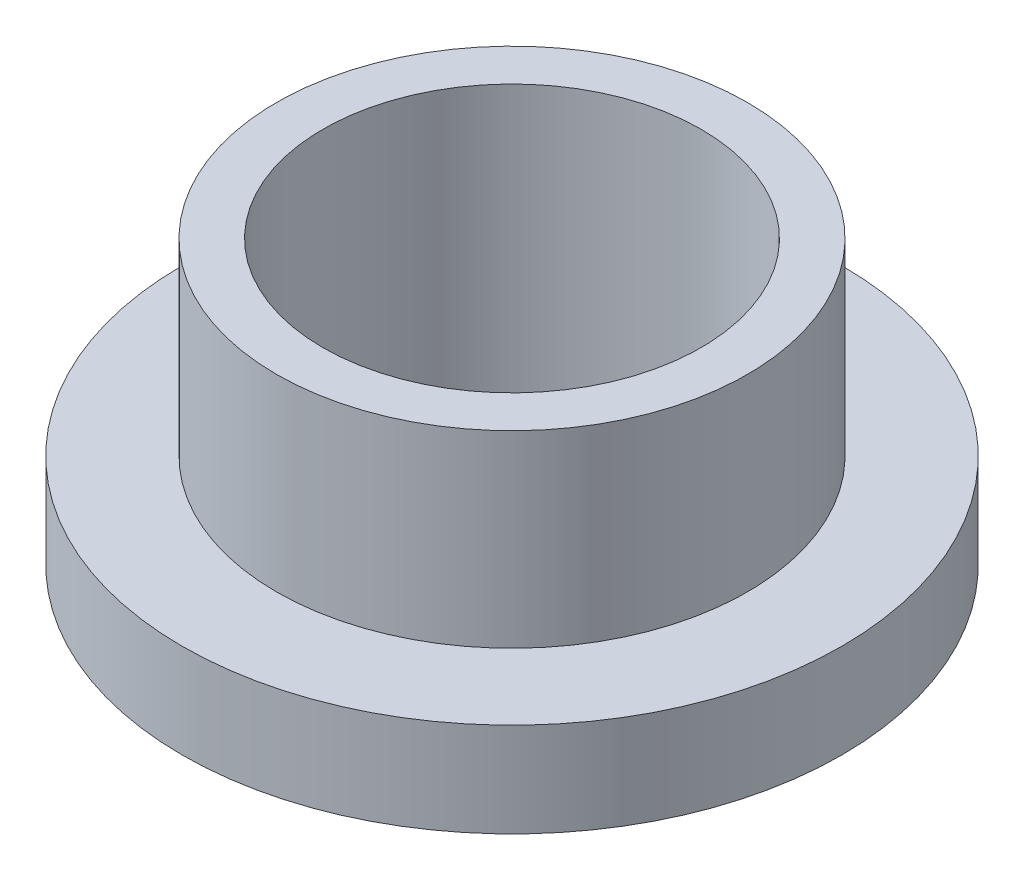
ISO-10303-21;
HEADER;
FILE_DESCRIPTION(('STEP AP214'),'2;1');
FILE_NAME('part.step','',(''),(''),'','','');
FILE_SCHEMA(('AUTOMOTIVE_DESIGN { 1 0 10303 214 1 1 1 1 }'));
ENDSEC;
DATA;
#1=APPLICATION_CONTEXT('core data for automotive mechanical design processes');
#2=APPLICATION_PROTOCOL_DEFINITION('international standard','automotive_design',2000,#1);
#3=PRODUCT_CONTEXT('',#1,'mechanical');
#4=PRODUCT('Part','Part','',(#3));
#5=PRODUCT_RELATED_PRODUCT_CATEGORY('part','',(#4));
#6=PRODUCT_DEFINITION_FORMATION('','',#4);
#7=PRODUCT_DEFINITION_CONTEXT('part definition',#1,'design');
#8=PRODUCT_DEFINITION('design','',#6,#7);
#9=PRODUCT_DEFINITION_SHAPE('','',#8);
#10=(LENGTH_UNIT() NAMED_UNIT(*) SI_UNIT(.MILLI.,.METRE.));
#11=(NAMED_UNIT(*) PLANE_ANGLE_UNIT() SI_UNIT($,.RADIAN.));
#12=(NAMED_UNIT(*) SI_UNIT($,.STERADIAN.) SOLID_ANGLE_UNIT());
#13=UNCERTAINTY_MEASURE_WITH_UNIT(LENGTH_MEASURE(1.E-05),#10,'distance_accuracy_value','');
#14=(GEOMETRIC_REPRESENTATION_CONTEXT(3) GLOBAL_UNCERTAINTY_ASSIGNED_CONTEXT((#13)) GLOBAL_UNIT_ASSIGNED_CONTEXT((#10,
#11,#12)) REPRESENTATION_CONTEXT('',''));
#15=CARTESIAN_POINT('',(0.,0.,0.));
#16=DIRECTION('',(0.,0.,1.));
#17=DIRECTION('',(1.,0.,0.));
#18=AXIS2_PLACEMENT_3D('',#15,#16,#17);
#19=CARTESIAN_POINT('',(0.,9.525,0.));
#20=DIRECTION('',(0.,1.,0.));
#21=DIRECTION('',(0.,0.,1.));
#22=AXIS2_PLACEMENT_3D('',#19,#20,#21);
#23=PLANE('',#22);
#24=CARTESIAN_POINT('',(0.,9.525,0.));
#25=DIRECTION('',(0.,1.,0.));
#26=DIRECTION('',(0.,0.,1.));
#27=AXIS2_PLACEMENT_3D('',#24,#25,#26);
#28=CIRCLE('',#27,7.9375);
#29=CARTESIAN_POINT('',(0.,9.525,-7.9375));
#30=VERTEX_POINT('',#29);
#31=EDGE_CURVE('E10',#30,#30,#28,.T.);
#32=ORIENTED_EDGE('',*,*,#31,.T.);
#33=EDGE_LOOP('',(#32));
#34=FACE_BOUND('',#33,.T.);
#35=CARTESIAN_POINT('',(0.,9.525,0.));
#36=DIRECTION('',(0.,1.,0.));
#37=DIRECTION('',(0.,0.,1.));
#38=AXIS2_PLACEMENT_3D('',#35,#36,#37);
#39=CIRCLE('',#38,6.3754);
#40=CARTESIAN_POINT('',(0.,9.525,-6.3754));
#41=VERTEX_POINT('',#40);
#42=EDGE_CURVE('E37',#41,#41,#39,.T.);
#43=ORIENTED_EDGE('',*,*,#42,.F.);
#44=EDGE_LOOP('',(#43));
#45=FACE_BOUND('',#44,.T.);
#46=ADVANCED_FACE('F30',(#34,#45),#23,.T.);
#47=CARTESIAN_POINT('',(0.,0.,0.));
#48=DIRECTION('',(0.,1.,0.));
#49=DIRECTION('',(0.,0.,1.));
#50=AXIS2_PLACEMENT_3D('',#47,#48,#49);
#51=PLANE('',#50);
#52=CARTESIAN_POINT('',(0.,0.,0.));
#53=DIRECTION('',(0.,1.,0.));
#54=DIRECTION('',(0.,0.,1.));
#55=AXIS2_PLACEMENT_3D('',#52,#53,#54);
#56=CIRCLE('',#55,6.3754);
#57=CARTESIAN_POINT('',(0.,0.,-6.3754));
#58=VERTEX_POINT('',#57);
#59=EDGE_CURVE('E41',#58,#58,#56,.T.);
#60=ORIENTED_EDGE('',*,*,#59,.T.);
#61=EDGE_LOOP('',(#60));
#62=FACE_BOUND('',#61,.T.);
#63=CARTESIAN_POINT('',(0.,0.,0.));
#64=DIRECTION('',(0.,1.,0.));
#65=DIRECTION('',(0.,0.,1.));
#66=AXIS2_PLACEMENT_3D('',#63,#64,#65);
#67=CIRCLE('',#66,11.1125);
#68=CARTESIAN_POINT('',(0.,0.,11.1125));
#69=VERTEX_POINT('',#68);
#70=EDGE_CURVE('E48',#69,#69,#67,.T.);
#71=ORIENTED_EDGE('',*,*,#70,.F.);
#72=EDGE_LOOP('',(#71));
#73=FACE_BOUND('',#72,.T.);
#74=ADVANCED_FACE('F73',(#62,#73),#51,.F.);
#75=CARTESIAN_POINT('',(0.,9.525,0.));
#76=DIRECTION('',(0.,-1.,0.));
#77=DIRECTION('',(0.,0.,-1.));
#78=AXIS2_PLACEMENT_3D('',#75,#76,#77);
#79=CYLINDRICAL_SURFACE('',#78,7.9375);
#80=CARTESIAN_POINT('',(0.,3.175,0.));
#81=DIRECTION('',(0.,1.,0.));
#82=DIRECTION('',(0.,0.,1.));
#83=AXIS2_PLACEMENT_3D('',#80,#81,#82);
#84=CIRCLE('',#83,7.9375);
#85=CARTESIAN_POINT('',(0.,3.175,-7.9375));
#86=VERTEX_POINT('',#85);
#87=EDGE_CURVE('E51',#86,#86,#84,.T.);
#88=CARTESIAN_POINT('',(0.,3.175,-7.9375));
#89=CARTESIAN_POINT('',(0.,3.24114583333333,-7.9375));
#90=CARTESIAN_POINT('',(0.,3.30729166666667,-7.9375));
#91=CARTESIAN_POINT('',(0.,3.43958333333333,-7.9375));
#92=CARTESIAN_POINT('',(0.,3.50572916666667,-7.9375));
#93=CARTESIAN_POINT('',(0.,3.63802083333333,-7.9375));
#94=CARTESIAN_POINT('',(0.,3.70416666666667,-7.9375));
#95=CARTESIAN_POINT('',(0.,3.83645833333333,-7.9375));
#96=CARTESIAN_POINT('',(0.,3.90260416666667,-7.9375));
#97=CARTESIAN_POINT('',(0.,4.03489583333333,-7.9375));
#98=CARTESIAN_POINT('',(0.,4.10104166666667,-7.9375));
#99=CARTESIAN_POINT('',(0.,4.23333333333333,-7.9375));
#100=CARTESIAN_POINT('',(0.,4.29947916666667,-7.9375));
#101=CARTESIAN_POINT('',(0.,4.43177083333333,-7.9375));
#102=CARTESIAN_POINT('',(0.,4.49791666666667,-7.9375));
#103=CARTESIAN_POINT('',(0.,4.63020833333333,-7.9375));
#104=CARTESIAN_POINT('',(0.,4.69635416666667,-7.9375));
#105=CARTESIAN_POINT('',(0.,4.82864583333333,-7.9375));
#106=CARTESIAN_POINT('',(0.,4.89479166666667,-7.9375));
#107=CARTESIAN_POINT('',(0.,5.02708333333333,-7.9375));
#108=CARTESIAN_POINT('',(0.,5.09322916666667,-7.9375));
#109=CARTESIAN_POINT('',(0.,5.22552083333333,-7.9375));
#110=CARTESIAN_POINT('',(0.,5.29166666666667,-7.9375));
#111=CARTESIAN_POINT('',(0.,5.42395833333333,-7.9375));
#112=CARTESIAN_POINT('',(0.,5.49010416666667,-7.9375));
#113=CARTESIAN_POINT('',(0.,5.62239583333333,-7.9375));
#114=CARTESIAN_POINT('',(0.,5.68854166666667,-7.9375));
#115=CARTESIAN_POINT('',(0.,5.82083333333333,-7.9375));
#116=CARTESIAN_POINT('',(0.,5.88697916666667,-7.9375));
#117=CARTESIAN_POINT('',(0.,6.01927083333333,-7.9375));
#118=CARTESIAN_POINT('',(0.,6.08541666666667,-7.9375));
#119=CARTESIAN_POINT('',(0.,6.21770833333333,-7.9375));
#120=CARTESIAN_POINT('',(0.,6.28385416666667,-7.9375));
#121=CARTESIAN_POINT('',(0.,6.41614583333333,-7.9375));
#122=CARTESIAN_POINT('',(0.,6.48229166666667,-7.9375));
#123=CARTESIAN_POINT('',(0.,6.61458333333333,-7.9375));
#124=CARTESIAN_POINT('',(0.,6.68072916666667,-7.9375));
#125=CARTESIAN_POINT('',(0.,6.81302083333333,-7.9375));
#126=CARTESIAN_POINT('',(0.,6.87916666666667,-7.9375));
#127=CARTESIAN_POINT('',(0.,7.01145833333333,-7.9375));
#128=CARTESIAN_POINT('',(0.,7.07760416666667,-7.9375));
#129=CARTESIAN_POINT('',(0.,7.20989583333333,-7.9375));
#130=CARTESIAN_POINT('',(0.,7.27604166666667,-7.9375));
#131=CARTESIAN_POINT('',(0.,7.40833333333333,-7.9375));
#132=CARTESIAN_POINT('',(0.,7.47447916666667,-7.9375));
#133=CARTESIAN_POINT('',(0.,7.60677083333333,-7.9375));
#134=CARTESIAN_POINT('',(0.,7.67291666666667,-7.9375));
#135=CARTESIAN_POINT('',(0.,7.80520833333333,-7.9375));
#136=CARTESIAN_POINT('',(0.,7.87135416666667,-7.9375));
#137=CARTESIAN_POINT('',(0.,8.00364583333333,-7.9375));
#138=CARTESIAN_POINT('',(0.,8.06979166666667,-7.9375));
#139=CARTESIAN_POINT('',(0.,8.20208333333333,-7.9375));
#140=CARTESIAN_POINT('',(0.,8.26822916666667,-7.9375));
#141=CARTESIAN_POINT('',(0.,8.40052083333333,-7.9375));
#142=CARTESIAN_POINT('',(0.,8.46666666666667,-7.9375));
#143=CARTESIAN_POINT('',(0.,8.59895833333333,-7.9375));
#144=CARTESIAN_POINT('',(0.,8.66510416666667,-7.9375));
#145=CARTESIAN_POINT('',(0.,8.79739583333333,-7.9375));
#146=CARTESIAN_POINT('',(0.,8.86354166666667,-7.9375));
#147=CARTESIAN_POINT('',(0.,8.99583333333333,-7.9375));
#148=CARTESIAN_POINT('',(0.,9.06197916666667,-7.9375));
#149=CARTESIAN_POINT('',(0.,9.19427083333333,-7.9375));
#150=CARTESIAN_POINT('',(0.,9.26041666666667,-7.9375));
#151=CARTESIAN_POINT('',(0.,9.39270833333333,-7.9375));
#152=CARTESIAN_POINT('',(0.,9.45885416666667,-7.9375));
#153=CARTESIAN_POINT('',(0.,9.525,-7.9375));
#154=B_SPLINE_CURVE_WITH_KNOTS('',3,(#88,#89,#90,#91,#92,#93,#94,#95,#96,#97,#98,#99,#100,#101,
#102,#103,#104,#105,#106,#107,#108,#109,#110,#111,#112,#113,#114,#115,#116,#117,#118,#119,#120,
#121,#122,#123,#124,#125,#126,#127,#128,#129,#130,#131,#132,#133,#134,#135,#136,#137,#138,#139,
#140,#141,#142,#143,#144,#145,#146,#147,#148,#149,#150,#151,#152,#153),.UNSPECIFIED.,.F.,.F.,(4,
2,2,2,2,2,2,2,2,2,2,2,2,2,2,2,2,2,2,2,2,2,2,2,2,2,2,2,2,2,2,2,4),(0.,0.1984375,0.396875,
0.5953125,0.79375,0.9921875,1.190625,1.3890625,1.5875,1.7859375,1.984375,2.1828125,2.38125,
2.5796875,2.778125,2.9765625,3.175,3.3734375,3.571875,3.7703125,3.96875,4.1671875,4.365625,
4.5640625,4.7625,4.9609375,5.159375,5.3578125,5.55625,5.7546875,5.953125,6.1515625,6.35),.UNSPECIFIED.);
#155=EDGE_CURVE('BSEAM32',#86,#30,#154,.T.);
#156=ORIENTED_EDGE('',*,*,#87,.T.);
#157=ORIENTED_EDGE('',*,*,#31,.F.);
#158=ORIENTED_EDGE('',*,*,#155,.T.);
#159=ORIENTED_EDGE('',*,*,#155,.F.);
#160=EDGE_LOOP('',(#156,#158,#157,#159));
#161=FACE_BOUND('',#160,.T.);
#162=ADVANCED_FACE('F32',(#161),#79,.T.);
#163=CARTESIAN_POINT('',(0.,9.525,0.));
#164=DIRECTION('',(0.,-1.,0.));
#165=DIRECTION('',(0.,0.,-1.));
#166=AXIS2_PLACEMENT_3D('',#163,#164,#165);
#167=CYLINDRICAL_SURFACE('',#166,6.3754);
#168=CARTESIAN_POINT('',(0.,9.525,-6.3754));
#169=CARTESIAN_POINT('',(0.,9.42578125,-6.3754));
#170=CARTESIAN_POINT('',(0.,9.3265625,-6.3754));
#171=CARTESIAN_POINT('',(0.,9.128125,-6.3754));
#172=CARTESIAN_POINT('',(0.,9.02890625,-6.3754));
#173=CARTESIAN_POINT('',(0.,8.83046875,-6.3754));
#174=CARTESIAN_POINT('',(0.,8.73125,-6.3754));
#175=CARTESIAN_POINT('',(0.,8.5328125,-6.3754));
#176=CARTESIAN_POINT('',(0.,8.43359375,-6.3754));
#177=CARTESIAN_POINT('',(0.,8.23515625,-6.3754));
#178=CARTESIAN_POINT('',(0.,8.1359375,-6.3754));
#179=CARTESIAN_POINT('',(0.,7.9375,-6.3754));
#180=CARTESIAN_POINT('',(0.,7.83828125,-6.3754));
#181=CARTESIAN_POINT('',(0.,7.63984375,-6.3754));
#182=CARTESIAN_POINT('',(0.,7.540625,-6.3754));
#183=CARTESIAN_POINT('',(0.,7.3421875,-6.3754));
#184=CARTESIAN_POINT('',(0.,7.24296875,-6.3754));
#185=CARTESIAN_POINT('',(0.,7.04453125,-6.3754));
#186=CARTESIAN_POINT('',(0.,6.9453125,-6.3754));
#187=CARTESIAN_POINT('',(0.,6.746875,-6.3754));
#188=CARTESIAN_POINT('',(0.,6.64765625,-6.3754));
#189=CARTESIAN_POINT('',(0.,6.44921875,-6.3754));
#190=CARTESIAN_POINT('',(0.,6.35,-6.3754));
#191=CARTESIAN_POINT('',(0.,6.1515625,-6.3754));
#192=CARTESIAN_POINT('',(0.,6.05234375,-6.3754));
#193=CARTESIAN_POINT('',(0.,5.85390625,-6.3754));
#194=CARTESIAN_POINT('',(0.,5.7546875,-6.3754));
#195=CARTESIAN_POINT('',(0.,5.55625,-6.3754));
#196=CARTESIAN_POINT('',(0.,5.45703125,-6.3754));
#197=CARTESIAN_POINT('',(0.,5.25859375,-6.3754));
#198=CARTESIAN_POINT('',(0.,5.159375,-6.3754));
#199=CARTESIAN_POINT('',(0.,4.9609375,-6.3754));
#200=CARTESIAN_POINT('',(0.,4.86171875,-6.3754));
#201=CARTESIAN_POINT('',(0.,4.66328125,-6.3754));
#202=CARTESIAN_POINT('',(0.,4.5640625,-6.3754));
#203=CARTESIAN_POINT('',(0.,4.365625,-6.3754));
#204=CARTESIAN_POINT('',(0.,4.26640625,-6.3754));
#205=CARTESIAN_POINT('',(0.,4.06796875,-6.3754));
#206=CARTESIAN_POINT('',(0.,3.96875,-6.3754));
#207=CARTESIAN_POINT('',(0.,3.7703125,-6.3754));
#208=CARTESIAN_POINT('',(0.,3.67109375,-6.3754));
#209=CARTESIAN_POINT('',(0.,3.47265625,-6.3754));
#210=CARTESIAN_POINT('',(0.,3.3734375,-6.3754));
#211=CARTESIAN_POINT('',(0.,3.175,-6.3754));
#212=CARTESIAN_POINT('',(0.,3.07578125,-6.3754));
#213=CARTESIAN_POINT('',(0.,2.87734375,-6.3754));
#214=CARTESIAN_POINT('',(0.,2.778125,-6.3754));
#215=CARTESIAN_POINT('',(0.,2.5796875,-6.3754));
#216=CARTESIAN_POINT('',(0.,2.48046875,-6.3754));
#217=CARTESIAN_POINT('',(0.,2.28203125,-6.3754));
#218=CARTESIAN_POINT('',(0.,2.1828125,-6.3754));
#219=CARTESIAN_POINT('',(0.,1.984375,-6.3754));
#220=CARTESIAN_POINT('',(0.,1.88515625,-6.3754));
#221=CARTESIAN_POINT('',(0.,1.68671875,-6.3754));
#222=CARTESIAN_POINT('',(0.,1.5875,-6.3754));
#223=CARTESIAN_POINT('',(0.,1.3890625,-6.3754));
#224=CARTESIAN_POINT('',(0.,1.28984375,-6.3754));
#225=CARTESIAN_POINT('',(0.,1.09140625,-6.3754));
#226=CARTESIAN_POINT('',(0.,0.992187500000001,-6.3754));
#227=CARTESIAN_POINT('',(0.,0.793750000000001,-6.3754));
#228=CARTESIAN_POINT('',(0.,0.69453125,-6.3754));
#229=CARTESIAN_POINT('',(0.,0.49609375,-6.3754));
#230=CARTESIAN_POINT('',(0.,0.396875,-6.3754));
#231=CARTESIAN_POINT('',(0.,0.1984375,-6.3754));
#232=CARTESIAN_POINT('',(0.,0.0992187500000001,-6.3754));
#233=CARTESIAN_POINT('',(0.,0.,-6.3754));
#234=B_SPLINE_CURVE_WITH_KNOTS('',3,(#168,#169,#170,#171,#172,#173,#174,#175,#176,#177,#178,
#179,#180,#181,#182,#183,#184,#185,#186,#187,#188,#189,#190,#191,#192,#193,#194,#195,#196,#197,
#198,#199,#200,#201,#202,#203,#204,#205,#206,#207,#208,#209,#210,#211,#212,#213,#214,#215,#216,
#217,#218,#219,#220,#221,#222,#223,#224,#225,#226,#227,#228,#229,#230,#231,#232,#233),
.UNSPECIFIED.,.F.,.F.,(4,2,2,2,2,2,2,2,2,2,2,2,2,2,2,2,2,2,2,2,2,2,2,2,2,2,2,2,2,2,2,2,4),(0.,
0.297656249999998,0.595312499999999,0.892968749999999,1.190625,1.48828125,1.7859375,2.08359375,
2.38125,2.67890625,2.9765625,3.27421875,3.571875,3.86953125,4.1671875,4.46484375,4.7625,
5.06015625,5.3578125,5.65546875,5.953125,6.25078125,6.5484375,6.84609375,7.14375,7.44140625,
7.7390625,8.03671875,8.334375,8.63203125,8.9296875,9.22734375,9.525),.UNSPECIFIED.);
#235=EDGE_CURVE('BSEAM62',#41,#58,#234,.T.);
#236=ORIENTED_EDGE('',*,*,#42,.T.);
#237=ORIENTED_EDGE('',*,*,#59,.F.);
#238=ORIENTED_EDGE('',*,*,#235,.T.);
#239=ORIENTED_EDGE('',*,*,#235,.F.);
#240=EDGE_LOOP('',(#236,#238,#237,#239));
#241=FACE_BOUND('',#240,.T.);
#242=ADVANCED_FACE('F62',(#241),#167,.F.);
#243=CARTESIAN_POINT('',(0.,3.175,0.));
#244=DIRECTION('',(0.,1.,0.));
#245=DIRECTION('',(0.,0.,1.));
#246=AXIS2_PLACEMENT_3D('',#243,#244,#245);
#247=PLANE('',#246);
#248=CARTESIAN_POINT('',(0.,3.175,0.));
#249=DIRECTION('',(0.,1.,0.));
#250=DIRECTION('',(0.,0.,1.));
#251=AXIS2_PLACEMENT_3D('',#248,#249,#250);
#252=CIRCLE('',#251,11.1125);
#253=CARTESIAN_POINT('',(0.,3.175,11.1125));
#254=VERTEX_POINT('',#253);
#255=EDGE_CURVE('E46',#254,#254,#252,.T.);
#256=ORIENTED_EDGE('',*,*,#255,.T.);
#257=EDGE_LOOP('',(#256));
#258=FACE_BOUND('',#257,.T.);
#259=ORIENTED_EDGE('',*,*,#87,.F.);
#260=EDGE_LOOP('',(#259));
#261=FACE_BOUND('',#260,.T.);
#262=ADVANCED_FACE('F59',(#258,#261),#247,.T.);
#263=CARTESIAN_POINT('',(0.,3.175,0.));
#264=DIRECTION('',(0.,-1.,0.));
#265=DIRECTION('',(0.,0.,-1.));
#266=AXIS2_PLACEMENT_3D('',#263,#264,#265);
#267=CYLINDRICAL_SURFACE('',#266,11.1125);
#268=ORIENTED_EDGE('',*,*,#255,.F.);
#269=EDGE_LOOP('',(#268));
#270=FACE_BOUND('',#269,.T.);
#271=ORIENTED_EDGE('',*,*,#70,.T.);
#272=EDGE_LOOP('',(#271));
#273=FACE_BOUND('',#272,.T.);
#274=ADVANCED_FACE('F61',(#270,#273),#267,.T.);
#275=CLOSED_SHELL('',(#46,#74,#162,#242,#262,#274));
#276=MANIFOLD_SOLID_BREP('B2',#275);
#277=ADVANCED_BREP_SHAPE_REPRESENTATION('',(#18,#276),#14);
#278=SHAPE_DEFINITION_REPRESENTATION(#9,#277);
ENDSEC;
END-ISO-10303-21;
